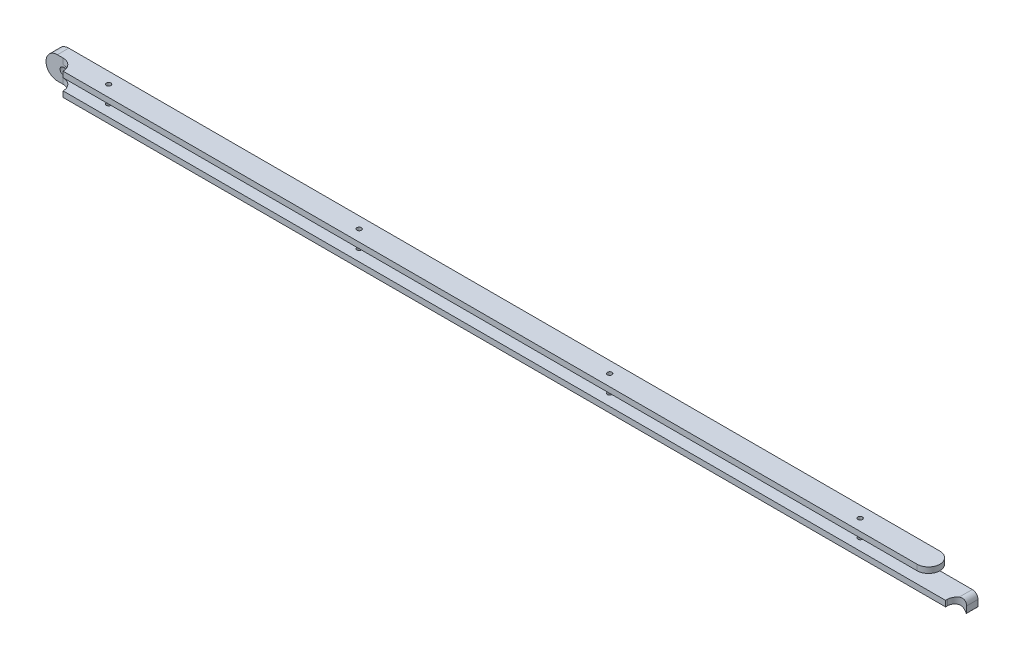
ISO-10303-21;
HEADER;
FILE_DESCRIPTION(('STEP AP214'),'2;1');
FILE_NAME('part.step','',(''),(''),'','','');
FILE_SCHEMA(('AUTOMOTIVE_DESIGN { 1 0 10303 214 1 1 1 1 }'));
ENDSEC;
DATA;
#1=APPLICATION_CONTEXT('core data for automotive mechanical design processes');
#2=APPLICATION_PROTOCOL_DEFINITION('international standard','automotive_design',2000,#1);
#3=PRODUCT_CONTEXT('',#1,'mechanical');
#4=PRODUCT('Part','Part','',(#3));
#5=PRODUCT_RELATED_PRODUCT_CATEGORY('part','',(#4));
#6=PRODUCT_DEFINITION_FORMATION('','',#4);
#7=PRODUCT_DEFINITION_CONTEXT('part definition',#1,'design');
#8=PRODUCT_DEFINITION('design','',#6,#7);
#9=PRODUCT_DEFINITION_SHAPE('','',#8);
#10=(LENGTH_UNIT() NAMED_UNIT(*) SI_UNIT(.MILLI.,.METRE.));
#11=(NAMED_UNIT(*) PLANE_ANGLE_UNIT() SI_UNIT($,.RADIAN.));
#12=(NAMED_UNIT(*) SI_UNIT($,.STERADIAN.) SOLID_ANGLE_UNIT());
#13=UNCERTAINTY_MEASURE_WITH_UNIT(LENGTH_MEASURE(1.E-05),#10,'distance_accuracy_value','');
#14=(GEOMETRIC_REPRESENTATION_CONTEXT(3) GLOBAL_UNCERTAINTY_ASSIGNED_CONTEXT((#13)) GLOBAL_UNIT_ASSIGNED_CONTEXT((#10,
#11,#12)) REPRESENTATION_CONTEXT('',''));
#15=CARTESIAN_POINT('',(0.,0.,0.));
#16=DIRECTION('',(0.,0.,1.));
#17=DIRECTION('',(1.,0.,0.));
#18=AXIS2_PLACEMENT_3D('',#15,#16,#17);
#19=CARTESIAN_POINT('',(187.499999999999,2.49999999999999,5.));
#20=DIRECTION('',(0.,-1.,0.));
#21=DIRECTION('',(0.,0.,-1.));
#22=AXIS2_PLACEMENT_3D('',#19,#20,#21);
#23=CYLINDRICAL_SURFACE('',#22,5.);
#24=DIRECTION('',(0.,-1.,0.));
#25=VECTOR('',#24,1.);
#26=CARTESIAN_POINT('',(187.499999999999,0.,10.));
#27=LINE('',#26,#25);
#28=CARTESIAN_POINT('',(187.499999999999,2.49999999999999,10.));
#29=VERTEX_POINT('',#28);
#30=CARTESIAN_POINT('',(187.499999999999,4.99999999999999,10.));
#31=VERTEX_POINT('',#30);
#32=EDGE_CURVE('E335',#29,#31,#27,.F.);
#33=ORIENTED_EDGE('',*,*,#32,.F.);
#34=CARTESIAN_POINT('',(187.499999999999,2.49999999999999,5.));
#35=DIRECTION('',(0.,1.,0.));
#36=DIRECTION('',(0.,0.,1.));
#37=AXIS2_PLACEMENT_3D('',#34,#35,#36);
#38=CIRCLE('',#37,5.);
#39=CARTESIAN_POINT('',(187.499999999999,2.49999999999999,0.));
#40=VERTEX_POINT('',#39);
#41=EDGE_CURVE('E46',#40,#29,#38,.F.);
#42=ORIENTED_EDGE('',*,*,#41,.F.);
#43=DIRECTION('',(0.,1.,0.));
#44=VECTOR('',#43,1.);
#45=CARTESIAN_POINT('',(187.499999999999,2.49999999999999,0.));
#46=LINE('',#45,#44);
#47=CARTESIAN_POINT('',(187.499999999999,4.99999999999999,0.));
#48=VERTEX_POINT('',#47);
#49=EDGE_CURVE('E359',#48,#40,#46,.F.);
#50=ORIENTED_EDGE('',*,*,#49,.F.);
#51=CARTESIAN_POINT('',(187.499999999999,4.99999999999999,5.));
#52=DIRECTION('',(0.,-1.,0.));
#53=DIRECTION('',(0.,0.,-1.));
#54=AXIS2_PLACEMENT_3D('',#51,#52,#53);
#55=CIRCLE('',#54,5.);
#56=EDGE_CURVE('E12',#31,#48,#55,.F.);
#57=ORIENTED_EDGE('',*,*,#56,.F.);
#58=EDGE_LOOP('',(#33,#42,#50,#57));
#59=FACE_BOUND('',#58,.T.);
#60=ADVANCED_FACE('F38',(#59),#23,.T.);
#61=CARTESIAN_POINT('',(-197.500000000001,2.49999999999999,5.));
#62=DIRECTION('',(0.,1.,0.));
#63=DIRECTION('',(0.,0.,1.));
#64=AXIS2_PLACEMENT_3D('',#61,#62,#63);
#65=PLANE('',#64);
#66=CARTESIAN_POINT('',(-172.500000000001,2.49999999999999,5.));
#67=DIRECTION('',(0.,1.,0.));
#68=DIRECTION('',(0.,0.,1.));
#69=AXIS2_PLACEMENT_3D('',#66,#67,#68);
#70=CIRCLE('',#69,0.999999999999998);
#71=CARTESIAN_POINT('',(-172.500000000001,2.49999999999999,6.));
#72=VERTEX_POINT('',#71);
#73=EDGE_CURVE('E191',#72,#72,#70,.T.);
#74=ORIENTED_EDGE('',*,*,#73,.T.);
#75=EDGE_LOOP('',(#74));
#76=FACE_BOUND('',#75,.T.);
#77=CARTESIAN_POINT('',(-62.5000000000008,2.49999999999999,5.));
#78=DIRECTION('',(0.,1.,0.));
#79=DIRECTION('',(0.,0.,1.));
#80=AXIS2_PLACEMENT_3D('',#77,#78,#79);
#81=CIRCLE('',#80,0.999999999999998);
#82=CARTESIAN_POINT('',(-62.5000000000008,2.49999999999999,6.));
#83=VERTEX_POINT('',#82);
#84=EDGE_CURVE('E356',#83,#83,#81,.T.);
#85=ORIENTED_EDGE('',*,*,#84,.T.);
#86=EDGE_LOOP('',(#85));
#87=FACE_BOUND('',#86,.T.);
#88=CARTESIAN_POINT('',(47.4999999999992,2.49999999999999,5.));
#89=DIRECTION('',(0.,1.,0.));
#90=DIRECTION('',(0.,0.,1.));
#91=AXIS2_PLACEMENT_3D('',#88,#89,#90);
#92=CIRCLE('',#91,0.999999999999998);
#93=CARTESIAN_POINT('',(47.4999999999992,2.49999999999999,6.));
#94=VERTEX_POINT('',#93);
#95=EDGE_CURVE('E351',#94,#94,#92,.T.);
#96=ORIENTED_EDGE('',*,*,#95,.T.);
#97=EDGE_LOOP('',(#96));
#98=FACE_BOUND('',#97,.T.);
#99=CARTESIAN_POINT('',(157.499999999999,2.49999999999999,5.));
#100=DIRECTION('',(0.,1.,0.));
#101=DIRECTION('',(0.,0.,1.));
#102=AXIS2_PLACEMENT_3D('',#99,#100,#101);
#103=CIRCLE('',#102,0.999999999999998);
#104=CARTESIAN_POINT('',(157.499999999999,2.49999999999999,6.));
#105=VERTEX_POINT('',#104);
#106=EDGE_CURVE('E346',#105,#105,#103,.T.);
#107=ORIENTED_EDGE('',*,*,#106,.T.);
#108=EDGE_LOOP('',(#107));
#109=FACE_BOUND('',#108,.T.);
#110=DIRECTION('',(1.,0.,0.));
#111=VECTOR('',#110,1.);
#112=CARTESIAN_POINT('',(-197.500000000001,2.49999999999999,0.));
#113=LINE('',#112,#111);
#114=CARTESIAN_POINT('',(-187.500000000001,2.49999999999999,0.));
#115=VERTEX_POINT('',#114);
#116=EDGE_CURVE('E252',#115,#40,#113,.T.);
#117=ORIENTED_EDGE('',*,*,#116,.T.);
#118=ORIENTED_EDGE('',*,*,#41,.T.);
#119=DIRECTION('',(1.,0.,0.));
#120=VECTOR('',#119,1.);
#121=CARTESIAN_POINT('',(-187.500000000001,2.49999999999999,10.));
#122=LINE('',#121,#120);
#123=CARTESIAN_POINT('',(-187.500000000001,2.49999999999999,10.));
#124=VERTEX_POINT('',#123);
#125=EDGE_CURVE('E199',#124,#29,#122,.T.);
#126=ORIENTED_EDGE('',*,*,#125,.F.);
#127=CARTESIAN_POINT('',(-192.500000000001,2.49999999999999,10.));
#128=DIRECTION('',(0.,1.,0.));
#129=DIRECTION('',(0.,0.,1.));
#130=AXIS2_PLACEMENT_3D('',#127,#128,#129);
#131=CIRCLE('',#130,5.);
#132=CARTESIAN_POINT('',(-192.500000000001,2.49999999999999,5.));
#133=VERTEX_POINT('',#132);
#134=EDGE_CURVE('E282',#133,#124,#131,.F.);
#135=ORIENTED_EDGE('',*,*,#134,.F.);
#136=DIRECTION('',(-1.,0.,0.));
#137=VECTOR('',#136,1.);
#138=CARTESIAN_POINT('',(0.,2.49999999999999,5.));
#139=LINE('',#138,#137);
#140=CARTESIAN_POINT('',(-187.500000000001,2.49999999999999,5.));
#141=VERTEX_POINT('',#140);
#142=EDGE_CURVE('E274',#141,#133,#139,.T.);
#143=ORIENTED_EDGE('',*,*,#142,.F.);
#144=DIRECTION('',(0.,0.,-1.));
#145=VECTOR('',#144,1.);
#146=CARTESIAN_POINT('',(-187.500000000001,2.49999999999999,5.));
#147=LINE('',#146,#145);
#148=EDGE_CURVE('E236',#141,#115,#147,.T.);
#149=ORIENTED_EDGE('',*,*,#148,.T.);
#150=EDGE_LOOP('',(#117,#118,#126,#135,#143,#149));
#151=FACE_BOUND('',#150,.T.);
#152=ADVANCED_FACE('F362',(#76,#87,#98,#109,#151),#65,.F.);
#153=CARTESIAN_POINT('',(-200.000000000001,4.99999999999999,5.));
#154=DIRECTION('',(0.,-1.,0.));
#155=DIRECTION('',(0.,0.,-1.));
#156=AXIS2_PLACEMENT_3D('',#153,#154,#155);
#157=PLANE('',#156);
#158=CARTESIAN_POINT('',(-172.500000000001,4.99999999999999,5.));
#159=DIRECTION('',(0.,1.,0.));
#160=DIRECTION('',(0.,0.,1.));
#161=AXIS2_PLACEMENT_3D('',#158,#159,#160);
#162=CIRCLE('',#161,0.999999999999998);
#163=CARTESIAN_POINT('',(-172.500000000001,4.99999999999999,6.));
#164=VERTEX_POINT('',#163);
#165=EDGE_CURVE('E341',#164,#164,#162,.T.);
#166=ORIENTED_EDGE('',*,*,#165,.F.);
#167=EDGE_LOOP('',(#166));
#168=FACE_BOUND('',#167,.T.);
#169=CARTESIAN_POINT('',(-62.5000000000008,4.99999999999999,5.));
#170=DIRECTION('',(0.,1.,0.));
#171=DIRECTION('',(0.,0.,1.));
#172=AXIS2_PLACEMENT_3D('',#169,#170,#171);
#173=CIRCLE('',#172,0.999999999999998);
#174=CARTESIAN_POINT('',(-62.5000000000008,4.99999999999999,6.));
#175=VERTEX_POINT('',#174);
#176=EDGE_CURVE('E672',#175,#175,#173,.T.);
#177=ORIENTED_EDGE('',*,*,#176,.F.);
#178=EDGE_LOOP('',(#177));
#179=FACE_BOUND('',#178,.T.);
#180=CARTESIAN_POINT('',(47.4999999999992,4.99999999999999,5.));
#181=DIRECTION('',(0.,1.,0.));
#182=DIRECTION('',(0.,0.,1.));
#183=AXIS2_PLACEMENT_3D('',#180,#181,#182);
#184=CIRCLE('',#183,0.999999999999998);
#185=CARTESIAN_POINT('',(47.4999999999992,4.99999999999999,6.));
#186=VERTEX_POINT('',#185);
#187=EDGE_CURVE('E669',#186,#186,#184,.T.);
#188=ORIENTED_EDGE('',*,*,#187,.F.);
#189=EDGE_LOOP('',(#188));
#190=FACE_BOUND('',#189,.T.);
#191=CARTESIAN_POINT('',(157.499999999999,4.99999999999999,5.));
#192=DIRECTION('',(0.,1.,0.));
#193=DIRECTION('',(0.,0.,1.));
#194=AXIS2_PLACEMENT_3D('',#191,#192,#193);
#195=CIRCLE('',#194,0.999999999999998);
#196=CARTESIAN_POINT('',(157.499999999999,4.99999999999999,6.));
#197=VERTEX_POINT('',#196);
#198=EDGE_CURVE('E666',#197,#197,#195,.T.);
#199=ORIENTED_EDGE('',*,*,#198,.F.);
#200=EDGE_LOOP('',(#199));
#201=FACE_BOUND('',#200,.T.);
#202=DIRECTION('',(-1.,0.,0.));
#203=VECTOR('',#202,1.);
#204=CARTESIAN_POINT('',(199.999999999999,4.99999999999999,10.));
#205=LINE('',#204,#203);
#206=CARTESIAN_POINT('',(-187.500000000001,4.99999999999999,10.));
#207=VERTEX_POINT('',#206);
#208=EDGE_CURVE('E209',#31,#207,#205,.T.);
#209=ORIENTED_EDGE('',*,*,#208,.F.);
#210=ORIENTED_EDGE('',*,*,#56,.T.);
#211=DIRECTION('',(-1.,0.,0.));
#212=VECTOR('',#211,1.);
#213=CARTESIAN_POINT('',(-200.000000000001,4.99999999999999,0.));
#214=LINE('',#213,#212);
#215=CARTESIAN_POINT('',(-195.000000000001,4.99999999999999,0.));
#216=VERTEX_POINT('',#215);
#217=EDGE_CURVE('E255',#48,#216,#214,.T.);
#218=ORIENTED_EDGE('',*,*,#217,.T.);
#219=DIRECTION('',(0.,0.,-1.));
#220=VECTOR('',#219,1.);
#221=CARTESIAN_POINT('',(-195.000000000001,4.99999999999999,5.));
#222=LINE('',#221,#220);
#223=CARTESIAN_POINT('',(-195.000000000001,4.99999999999999,5.));
#224=VERTEX_POINT('',#223);
#225=EDGE_CURVE('E266',#216,#224,#222,.F.);
#226=ORIENTED_EDGE('',*,*,#225,.T.);
#227=DIRECTION('',(-1.,0.,0.));
#228=VECTOR('',#227,1.);
#229=CARTESIAN_POINT('',(-200.000000000001,4.99999999999999,5.));
#230=LINE('',#229,#228);
#231=CARTESIAN_POINT('',(-192.500000000001,4.99999999999999,5.));
#232=VERTEX_POINT('',#231);
#233=EDGE_CURVE('E244',#232,#224,#230,.T.);
#234=ORIENTED_EDGE('',*,*,#233,.F.);
#235=CARTESIAN_POINT('',(-192.500000000001,4.99999999999999,10.));
#236=DIRECTION('',(0.,-1.,0.));
#237=DIRECTION('',(0.,0.,-1.));
#238=AXIS2_PLACEMENT_3D('',#235,#236,#237);
#239=CIRCLE('',#238,5.);
#240=EDGE_CURVE('E280',#207,#232,#239,.F.);
#241=ORIENTED_EDGE('',*,*,#240,.F.);
#242=EDGE_LOOP('',(#209,#210,#218,#226,#234,#241));
#243=FACE_BOUND('',#242,.T.);
#244=ADVANCED_FACE('F389',(#168,#179,#190,#201,#243),#157,.F.);
#245=CARTESIAN_POINT('',(0.,0.,0.));
#246=DIRECTION('',(0.,0.,1.));
#247=DIRECTION('',(1.,0.,0.));
#248=AXIS2_PLACEMENT_3D('',#245,#246,#247);
#249=PLANE('',#248);
#250=CARTESIAN_POINT('',(-192.311689795541,0.0941551022299583,0.));
#251=DIRECTION('',(0.,0.,-1.));
#252=DIRECTION('',(-1.,0.,0.));
#253=AXIS2_PLACEMENT_3D('',#250,#251,#252);
#254=CIRCLE('',#253,1.5);
#255=CARTESIAN_POINT('',(-193.811689795541,0.0941551022299583,0.));
#256=VERTEX_POINT('',#255);
#257=EDGE_CURVE('E226',#256,#256,#254,.T.);
#258=ORIENTED_EDGE('',*,*,#257,.F.);
#259=EDGE_LOOP('',(#258));
#260=FACE_BOUND('',#259,.T.);
#261=ORIENTED_EDGE('',*,*,#217,.F.);
#262=ORIENTED_EDGE('',*,*,#49,.T.);
#263=ORIENTED_EDGE('',*,*,#116,.F.);
#264=DIRECTION('',(0.,-1.,0.));
#265=VECTOR('',#264,1.);
#266=CARTESIAN_POINT('',(-187.500000000001,0.,0.));
#267=LINE('',#266,#265);
#268=CARTESIAN_POINT('',(-187.500000000001,-2.50000000000002,0.));
#269=VERTEX_POINT('',#268);
#270=EDGE_CURVE('E230',#115,#269,#267,.T.);
#271=ORIENTED_EDGE('',*,*,#270,.T.);
#272=DIRECTION('',(-1.,0.,0.));
#273=VECTOR('',#272,1.);
#274=CARTESIAN_POINT('',(-197.500000000001,-2.50000000000002,0.));
#275=LINE('',#274,#273);
#276=CARTESIAN_POINT('',(201.738979537004,-2.50000000000002,0.));
#277=VERTEX_POINT('',#276);
#278=EDGE_CURVE('E242',#277,#269,#275,.T.);
#279=ORIENTED_EDGE('',*,*,#278,.F.);
#280=CARTESIAN_POINT('',(201.738979537004,-5.00000000000002,0.));
#281=DIRECTION('',(0.,0.,-1.));
#282=DIRECTION('',(-1.,0.,0.));
#283=AXIS2_PLACEMENT_3D('',#280,#281,#282);
#284=CIRCLE('',#283,2.5);
#285=CARTESIAN_POINT('',(204.238979537004,-5.00000000000004,0.));
#286=VERTEX_POINT('',#285);
#287=EDGE_CURVE('E179',#286,#277,#284,.F.);
#288=ORIENTED_EDGE('',*,*,#287,.F.);
#289=DIRECTION('',(0.,1.,0.));
#290=VECTOR('',#289,1.);
#291=CARTESIAN_POINT('',(204.238979537004,0.,0.));
#292=LINE('',#291,#290);
#293=CARTESIAN_POINT('',(204.238979537004,-7.7599996640987,0.));
#294=VERTEX_POINT('',#293);
#295=EDGE_CURVE('E189',#294,#286,#292,.T.);
#296=ORIENTED_EDGE('',*,*,#295,.F.);
#297=CARTESIAN_POINT('',(204.113979537004,-7.7599996640987,0.));
#298=DIRECTION('',(0.,0.,-1.));
#299=DIRECTION('',(-1.,0.,0.));
#300=AXIS2_PLACEMENT_3D('',#297,#298,#299);
#301=CIRCLE('',#300,0.124999999999988);
#302=CARTESIAN_POINT('',(203.996457300071,-7.80258515254749,0.));
#303=VERTEX_POINT('',#302);
#304=EDGE_CURVE('E164',#294,#303,#301,.T.);
#305=ORIENTED_EDGE('',*,*,#304,.T.);
#306=CARTESIAN_POINT('',(199.999999999999,-9.25074586349727,0.));
#307=DIRECTION('',(0.,0.,-1.));
#308=DIRECTION('',(-1.,0.,0.));
#309=AXIS2_PLACEMENT_3D('',#306,#307,#308);
#310=CIRCLE('',#309,4.25074586349726);
#311=CARTESIAN_POINT('',(199.999999999999,-5.00000000000002,0.));
#312=VERTEX_POINT('',#311);
#313=EDGE_CURVE('E193',#312,#303,#310,.T.);
#314=ORIENTED_EDGE('',*,*,#313,.F.);
#315=DIRECTION('',(1.,0.,0.));
#316=VECTOR('',#315,1.);
#317=CARTESIAN_POINT('',(-200.000000000001,-5.00000000000002,0.));
#318=LINE('',#317,#316);
#319=CARTESIAN_POINT('',(-195.000000000001,-5.00000000000002,0.));
#320=VERTEX_POINT('',#319);
#321=EDGE_CURVE('E247',#320,#312,#318,.T.);
#322=ORIENTED_EDGE('',*,*,#321,.F.);
#323=CARTESIAN_POINT('',(-195.000000000001,0.,0.));
#324=DIRECTION('',(0.,0.,1.));
#325=DIRECTION('',(1.,0.,0.));
#326=AXIS2_PLACEMENT_3D('',#323,#324,#325);
#327=CIRCLE('',#326,5.);
#328=EDGE_CURVE('E271',#320,#216,#327,.F.);
#329=ORIENTED_EDGE('',*,*,#328,.T.);
#330=EDGE_LOOP('',(#261,#262,#263,#271,#279,#288,#296,#305,#314,#322,#329));
#331=FACE_BOUND('',#330,.T.);
#332=ADVANCED_FACE('F386',(#260,#331),#249,.F.);
#333=CARTESIAN_POINT('',(0.,0.,10.));
#334=DIRECTION('',(0.,0.,1.));
#335=DIRECTION('',(1.,0.,0.));
#336=AXIS2_PLACEMENT_3D('',#333,#334,#335);
#337=PLANE('',#336);
#338=ORIENTED_EDGE('',*,*,#125,.T.);
#339=ORIENTED_EDGE('',*,*,#32,.T.);
#340=ORIENTED_EDGE('',*,*,#208,.T.);
#341=DIRECTION('',(0.,1.,0.));
#342=VECTOR('',#341,1.);
#343=CARTESIAN_POINT('',(-187.500000000001,2.49999999999999,10.));
#344=LINE('',#343,#342);
#345=EDGE_CURVE('E211',#124,#207,#344,.T.);
#346=ORIENTED_EDGE('',*,*,#345,.F.);
#347=EDGE_LOOP('',(#338,#339,#340,#346));
#348=FACE_BOUND('',#347,.T.);
#349=ADVANCED_FACE('F366',(#348),#337,.T.);
#350=CARTESIAN_POINT('',(204.199999999999,0.,9.2));
#351=DIRECTION('',(0.,1.,0.));
#352=DIRECTION('',(0.,0.,1.));
#353=AXIS2_PLACEMENT_3D('',#350,#351,#352);
#354=CYLINDRICAL_SURFACE('',#353,4.2);
#355=CARTESIAN_POINT('',(204.199999999999,-4.56025202590845,5.));
#356=CARTESIAN_POINT('',(204.187804600789,-4.49196481343647,5.00001083744535));
#357=CARTESIAN_POINT('',(204.172754868996,-4.42419008745765,5.00005335432068));
#358=CARTESIAN_POINT('',(204.137078432987,-4.29012276381103,5.00043058945621));
#359=CARTESIAN_POINT('',(204.116451511297,-4.22383022404787,5.00076531911192));
#360=CARTESIAN_POINT('',(204.069729351325,-4.09312266042863,5.00195646927419));
#361=CARTESIAN_POINT('',(204.043628512036,-4.02870963722634,5.0028134258573));
#362=CARTESIAN_POINT('',(203.986178029292,-3.90230881771838,5.00534787190019));
#363=CARTESIAN_POINT('',(203.954828547608,-3.84032094673799,5.00702533607359));
#364=CARTESIAN_POINT('',(203.853132296124,-3.65850608631455,5.01379444432655));
#365=CARTESIAN_POINT('',(203.775155342878,-3.5428770101095,5.02062284722559));
#366=CARTESIAN_POINT('',(203.601580455367,-3.32670128543189,5.04193567246018));
#367=CARTESIAN_POINT('',(203.505997687653,-3.22614178945197,5.05641352507379));
#368=CARTESIAN_POINT('',(203.303950025444,-3.04587339623523,5.09545057690654));
#369=CARTESIAN_POINT('',(203.197914639677,-2.96561450055826,5.11968314015636));
#370=CARTESIAN_POINT('',(202.977089057138,-2.82416575109094,5.1803544200784));
#371=CARTESIAN_POINT('',(202.862306389895,-2.76295972259811,5.21678272848409));
#372=CARTESIAN_POINT('',(202.635203022091,-2.66304211219622,5.30060411169939));
#373=CARTESIAN_POINT('',(202.523074419053,-2.62330999307034,5.34731348658621));
#374=CARTESIAN_POINT('',(202.299384246619,-2.56084938538221,5.45260769974086));
#375=CARTESIAN_POINT('',(202.187824240284,-2.53815473244006,5.51121587693495));
#376=CARTESIAN_POINT('',(202.021457733276,-2.51533941143618,5.60857192436485));
#377=CARTESIAN_POINT('',(201.965021819095,-2.50961358464844,5.64341540541011));
#378=CARTESIAN_POINT('',(201.853660150564,-2.50200913348351,5.71587972218794));
#379=CARTESIAN_POINT('',(201.798734792702,-2.500131509847,5.75350127773535));
#380=CARTESIAN_POINT('',(201.690962055808,-2.49988226487252,5.83115404836204));
#381=CARTESIAN_POINT('',(201.638107131903,-2.5014964109182,5.87117483737245));
#382=CARTESIAN_POINT('',(201.534498381273,-2.50783637828312,5.9535421371921));
#383=CARTESIAN_POINT('',(201.483742965642,-2.51255979895699,5.99588683063193));
#384=CARTESIAN_POINT('',(201.434125233665,-2.51865684482455,6.0393138756026));
#385=B_SPLINE_CURVE_WITH_KNOTS('',3,(#355,#356,#357,#358,#359,#360,#361,#362,#363,#364,#365,
#366,#367,#368,#369,#370,#371,#372,#373,#374,#375,#376,#377,#378,#379,#380,#381,#382,#383,#384),
.UNSPECIFIED.,.F.,.F.,(4,2,2,2,2,2,2,2,2,2,2,2,2,2,4),(0.,0.208038043310331,0.416084199901774,
0.624344280687321,0.832597943722679,1.2492599613514,1.66556470954167,2.06895638881991,
2.47200467372262,2.85368487037161,3.23612107551123,3.43568316656409,3.63529714795821,
3.83409902698967,4.03274759247663),.UNSPECIFIED.);
#386=CARTESIAN_POINT('',(201.738979537004,-2.50000000000002,5.79656375398078));
#387=VERTEX_POINT('',#386);
#388=CARTESIAN_POINT('',(204.199999999999,-4.56025202590845,5.));
#389=VERTEX_POINT('',#388);
#390=EDGE_CURVE('E297',#387,#389,#385,.F.);
#391=ORIENTED_EDGE('',*,*,#390,.F.);
#392=CARTESIAN_POINT('',(204.199999999999,-2.50000000000002,9.2));
#393=DIRECTION('',(0.,-1.,0.));
#394=DIRECTION('',(1.,0.,0.));
#395=AXIS2_PLACEMENT_3D('',#392,#393,#394);
#396=CIRCLE('',#395,4.2);
#397=CARTESIAN_POINT('',(199.999999999999,-2.50000000000002,9.2));
#398=VERTEX_POINT('',#397);
#399=EDGE_CURVE('E336',#387,#398,#396,.F.);
#400=ORIENTED_EDGE('',*,*,#399,.T.);
#401=DIRECTION('',(0.,-1.,0.));
#402=VECTOR('',#401,1.);
#403=CARTESIAN_POINT('',(199.999999999999,0.,9.2));
#404=LINE('',#403,#402);
#405=CARTESIAN_POINT('',(199.999999999999,-5.00000000000002,9.2));
#406=VERTEX_POINT('',#405);
#407=EDGE_CURVE('E294',#406,#398,#404,.F.);
#408=ORIENTED_EDGE('',*,*,#407,.F.);
#409=CARTESIAN_POINT('',(203.996457300071,-7.8025851525475,5.00493499820252));
#410=CARTESIAN_POINT('',(203.959508884253,-7.70058280623714,5.0067453099316));
#411=CARTESIAN_POINT('',(203.918632285732,-7.60000293685804,5.00920081449357));
#412=CARTESIAN_POINT('',(203.829326180983,-7.40227442697984,5.01614445383127));
#413=CARTESIAN_POINT('',(203.780893285038,-7.3051273505205,5.0206335025739));
#414=CARTESIAN_POINT('',(203.676528893815,-7.11442654751201,5.03241813279791));
#415=CARTESIAN_POINT('',(203.620558056291,-7.02089523249275,5.03972884231316));
#416=CARTESIAN_POINT('',(203.501786143111,-6.83865997074523,5.05800666788615));
#417=CARTESIAN_POINT('',(203.438986040822,-6.7499553387726,5.06897326333388));
#418=CARTESIAN_POINT('',(203.306835828267,-6.57763562373711,5.09551249771345));
#419=CARTESIAN_POINT('',(203.237457309206,-6.49404544222408,5.11110579654904));
#420=CARTESIAN_POINT('',(203.093170493742,-6.33307290919273,5.14778256456306));
#421=CARTESIAN_POINT('',(203.018262853294,-6.25568982355181,5.16886538323161));
#422=CARTESIAN_POINT('',(202.864132018409,-6.1079853305902,5.2172925605384));
#423=CARTESIAN_POINT('',(202.784923462039,-6.03764203446419,5.24461658467739));
#424=CARTESIAN_POINT('',(202.623151658287,-5.90427005062843,5.30628247832193));
#425=CARTESIAN_POINT('',(202.540588885846,-5.84124033219158,5.34062335703051));
#426=CARTESIAN_POINT('',(202.381355248289,-5.72844645373988,5.41325329668081));
#427=CARTESIAN_POINT('',(202.304863280641,-5.67799179783718,5.4508643281638));
#428=CARTESIAN_POINT('',(202.151342648656,-5.5835005989259,5.53249975445992));
#429=CARTESIAN_POINT('',(202.0743140251,-5.53946357370883,5.57652366692391));
#430=CARTESIAN_POINT('',(201.92080356399,-5.45773624540006,5.6710633872094));
#431=CARTESIAN_POINT('',(201.844322076643,-5.42004971011267,5.72158301788428));
#432=CARTESIAN_POINT('',(201.69305616386,-5.35083293551133,5.82897104653955));
#433=CARTESIAN_POINT('',(201.618271709356,-5.31930259067762,5.88583933567492));
#434=CARTESIAN_POINT('',(201.4768158224,-5.26411942812512,6.0012540614143));
#435=CARTESIAN_POINT('',(201.409951941642,-5.2400581110707,6.05937044506805));
#436=CARTESIAN_POINT('',(201.279259677469,-5.1964784111223,6.18052435460614));
#437=CARTESIAN_POINT('',(201.21543226278,-5.17696147039339,6.24356343426359));
#438=CARTESIAN_POINT('',(201.029505100269,-5.12454564034053,6.43951410154693));
#439=CARTESIAN_POINT('',(200.912852136182,-5.0977416935635,6.5793468201262));
#440=CARTESIAN_POINT('',(200.689003003539,-5.05452748296392,6.88653943971975));
#441=CARTESIAN_POINT('',(200.583444178731,-5.03918958930083,7.05522765144601));
#442=CARTESIAN_POINT('',(200.397041768414,-5.01753991935913,7.40639562671392));
#443=CARTESIAN_POINT('',(200.316209901701,-5.01123241763983,7.58888187859445));
#444=CARTESIAN_POINT('',(200.210681616989,-5.00505673807253,7.88167666939876));
#445=CARTESIAN_POINT('',(200.176874769855,-5.00358012369789,7.98877198535147));
#446=CARTESIAN_POINT('',(200.117931951032,-5.00153292862819,8.20536267286855));
#447=CARTESIAN_POINT('',(200.092796656375,-5.00096241866461,8.31485823112212));
#448=CARTESIAN_POINT('',(200.051372017409,-5.00026007866006,8.53554533166774));
#449=CARTESIAN_POINT('',(200.0350858121,-5.00012840420034,8.64673746141668));
#450=CARTESIAN_POINT('',(200.011473523204,-4.99999909022755,8.87006999932316));
#451=CARTESIAN_POINT('',(200.004147495357,-5.00000145154828,8.9822104133754));
#452=CARTESIAN_POINT('',(199.998367558536,-4.99999890165392,9.2121777076191));
#453=CARTESIAN_POINT('',(200.000362115298,-4.99999363143426,9.3300160914179));
#454=CARTESIAN_POINT('',(200.014243094255,-5.00001891386636,9.56511440523739));
#455=CARTESIAN_POINT('',(200.026130101329,-5.00004946863628,9.68237430064329));
#456=CARTESIAN_POINT('',(200.059730047659,-5.0003841094806,9.91557333324442));
#457=CARTESIAN_POINT('',(200.08145077687,-5.00068841259858,10.0315113484996));
#458=CARTESIAN_POINT('',(200.134550788859,-5.00205605773175,10.2611506997448));
#459=CARTESIAN_POINT('',(200.165930234006,-5.00311941250753,10.3748519980999));
#460=CARTESIAN_POINT('',(200.202053851639,-5.00480490334763,10.4870223754138));
#461=B_SPLINE_CURVE_WITH_KNOTS('',3,(#409,#410,#411,#412,#413,#414,#415,#416,#417,#418,#419,
#420,#421,#422,#423,#424,#425,#426,#427,#428,#429,#430,#431,#432,#433,#434,#435,#436,#437,#438,
#439,#440,#441,#442,#443,#444,#445,#446,#447,#448,#449,#450,#451,#452,#453,#454,#455,#456,#457,
#458,#459,#460),.UNSPECIFIED.,.F.,.F.,(4,2,2,2,2,2,2,2,2,2,2,2,2,2,2,2,2,2,2,2,2,2,2,2,2,4),(0.,
0.325445611891434,0.651037639131569,0.978400101016581,1.30571596532491,1.63451599194728,
1.96327707337802,2.29098192122684,2.61864052828941,2.9153902449512,3.21211765289795,
3.50902049677627,3.80591825116429,4.08100903881601,4.35618700834317,4.90611280879823,
5.50260742938219,6.09938430898598,6.43601589926034,6.77267376606791,7.1094509761926,
7.4462302813284,7.7993762515581,8.15254310260623,8.5059902118575,8.85944326313241),.UNSPECIFIED.);
#462=CARTESIAN_POINT('',(203.996457300071,-7.80258515254751,5.00493499820252));
#463=VERTEX_POINT('',#462);
#464=EDGE_CURVE('E328',#406,#463,#461,.F.);
#465=ORIENTED_EDGE('',*,*,#464,.T.);
#466=CARTESIAN_POINT('',(204.199999999999,-7.85069409582434,5.));
#467=CARTESIAN_POINT('',(204.194903380064,-7.85553630432866,4.99999966383895));
#468=CARTESIAN_POINT('',(204.189391920949,-7.85993857551015,5.00000924043573));
#469=CARTESIAN_POINT('',(204.177714785506,-7.86775749551297,5.00005516252043));
#470=CARTESIAN_POINT('',(204.171549572326,-7.87117483580515,5.00009148916446));
#471=CARTESIAN_POINT('',(204.158729727055,-7.87692660020943,5.00019785962558));
#472=CARTESIAN_POINT('',(204.152074866696,-7.87926051548515,5.00026791925414));
#473=CARTESIAN_POINT('',(204.138470002124,-7.88277810353593,5.00044523159231));
#474=CARTESIAN_POINT('',(204.131520064719,-7.88396203524044,5.00055247592204));
#475=CARTESIAN_POINT('',(204.117521034263,-7.88514680345868,5.00080409729742));
#476=CARTESIAN_POINT('',(204.110471945963,-7.88514769645053,5.00094847257011));
#477=CARTESIAN_POINT('',(204.096472778767,-7.88396686035858,5.00127029303848));
#478=CARTESIAN_POINT('',(204.089522721878,-7.88278487246755,5.00144774546433));
#479=CARTESIAN_POINT('',(204.075917143506,-7.87927095442922,5.0018278013167));
#480=CARTESIAN_POINT('',(204.06926175215,-7.87693852165061,5.00203041570754));
#481=CARTESIAN_POINT('',(204.056438575484,-7.87119048193246,5.00244936874127));
#482=CARTESIAN_POINT('',(204.050270688956,-7.86777510058093,5.00266570451837));
#483=CARTESIAN_POINT('',(204.038591731603,-7.85995511364837,5.00309857048755));
#484=CARTESIAN_POINT('',(204.033081097235,-7.85554985626455,5.00331510071366));
#485=CARTESIAN_POINT('',(204.02287607075,-7.84587533651206,5.00373342020282));
#486=CARTESIAN_POINT('',(204.018181852049,-7.84060589104084,5.00393520632877));
#487=CARTESIAN_POINT('',(204.009748136118,-7.82935464857154,5.00430908308941));
#488=CARTESIAN_POINT('',(204.006008195456,-7.82337318433411,5.00448118750439));
#489=CARTESIAN_POINT('',(203.999578031763,-7.81086413070219,5.00478357770873));
#490=CARTESIAN_POINT('',(203.996888585102,-7.8043361417077,5.00491383255649));
#491=CARTESIAN_POINT('',(203.994776178631,-7.79762358405079,5.00501690311595));
#492=B_SPLINE_CURVE_WITH_KNOTS('',3,(#466,#467,#468,#469,#470,#471,#472,#473,#474,#475,#476,
#477,#478,#479,#480,#481,#482,#483,#484,#485,#486,#487,#488,#489,#490,#491),.UNSPECIFIED.,.F.,
.F.,(4,2,2,2,2,2,2,2,2,2,2,2,4),(0.,0.0210623638286904,0.0421099046017932,0.063167320489673,
0.084219994005732,0.10527166246969,0.126327937919234,0.147393421050756,0.168454518930686,
0.189529525744722,0.210609003674272,0.231678668543729,0.252763875666101),.UNSPECIFIED.);
#493=CARTESIAN_POINT('',(204.199999999999,-7.85069409582434,5.));
#494=VERTEX_POINT('',#493);
#495=EDGE_CURVE('E304',#494,#463,#492,.T.);
#496=ORIENTED_EDGE('',*,*,#495,.F.);
#497=DIRECTION('',(0.,-1.,0.));
#498=VECTOR('',#497,1.);
#499=CARTESIAN_POINT('',(204.199999999999,0.,5.));
#500=LINE('',#499,#498);
#501=EDGE_CURVE('E184',#389,#494,#500,.T.);
#502=ORIENTED_EDGE('',*,*,#501,.F.);
#503=EDGE_LOOP('',(#391,#400,#408,#465,#496,#502));
#504=FACE_BOUND('',#503,.T.);
#505=ADVANCED_FACE('F311',(#504),#354,.F.);
#506=CARTESIAN_POINT('',(199.999999999999,-2.50000000000002,5.));
#507=DIRECTION('',(-1.,0.,0.));
#508=DIRECTION('',(0.,0.,1.));
#509=AXIS2_PLACEMENT_3D('',#506,#507,#508);
#510=PLANE('',#509);
#511=DIRECTION('',(0.,0.,-1.));
#512=VECTOR('',#511,1.);
#513=CARTESIAN_POINT('',(199.999999999999,-5.00000000000002,5.));
#514=LINE('',#513,#512);
#515=CARTESIAN_POINT('',(199.999999999999,-5.00000000000002,10.));
#516=VERTEX_POINT('',#515);
#517=EDGE_CURVE('E250',#516,#406,#514,.T.);
#518=ORIENTED_EDGE('',*,*,#517,.T.);
#519=ORIENTED_EDGE('',*,*,#407,.T.);
#520=DIRECTION('',(0.,0.,-1.));
#521=VECTOR('',#520,1.);
#522=CARTESIAN_POINT('',(199.999999999999,-2.50000000000002,5.));
#523=LINE('',#522,#521);
#524=CARTESIAN_POINT('',(199.999999999999,-2.50000000000002,10.));
#525=VERTEX_POINT('',#524);
#526=EDGE_CURVE('E260',#525,#398,#523,.T.);
#527=ORIENTED_EDGE('',*,*,#526,.F.);
#528=DIRECTION('',(0.,1.,0.));
#529=VECTOR('',#528,1.);
#530=CARTESIAN_POINT('',(199.999999999999,-5.00000000000002,10.));
#531=LINE('',#530,#529);
#532=EDGE_CURVE('E220',#516,#525,#531,.T.);
#533=ORIENTED_EDGE('',*,*,#532,.F.);
#534=EDGE_LOOP('',(#518,#519,#527,#533));
#535=FACE_BOUND('',#534,.T.);
#536=ADVANCED_FACE('F407',(#535),#510,.F.);
#537=CARTESIAN_POINT('',(-192.500000000001,-5.00000000000002,10.));
#538=DIRECTION('',(0.,1.,0.));
#539=DIRECTION('',(0.,0.,1.));
#540=AXIS2_PLACEMENT_3D('',#537,#538,#539);
#541=CYLINDRICAL_SURFACE('',#540,5.);
#542=DIRECTION('',(0.,1.,0.));
#543=VECTOR('',#542,1.);
#544=CARTESIAN_POINT('',(-187.500000000001,-5.00000000000002,10.));
#545=LINE('',#544,#543);
#546=CARTESIAN_POINT('',(-187.500000000001,-5.00000000000002,10.));
#547=VERTEX_POINT('',#546);
#548=CARTESIAN_POINT('',(-187.500000000001,-2.50000000000002,10.));
#549=VERTEX_POINT('',#548);
#550=EDGE_CURVE('E214',#547,#549,#545,.T.);
#551=ORIENTED_EDGE('',*,*,#550,.T.);
#552=CARTESIAN_POINT('',(-192.500000000001,-2.50000000000002,10.));
#553=DIRECTION('',(0.,-1.,0.));
#554=DIRECTION('',(1.,0.,0.));
#555=AXIS2_PLACEMENT_3D('',#552,#553,#554);
#556=CIRCLE('',#555,5.);
#557=CARTESIAN_POINT('',(-192.500000000001,-2.50000000000002,5.));
#558=VERTEX_POINT('',#557);
#559=EDGE_CURVE('E289',#549,#558,#556,.F.);
#560=ORIENTED_EDGE('',*,*,#559,.T.);
#561=DIRECTION('',(0.,-1.,0.));
#562=VECTOR('',#561,1.);
#563=CARTESIAN_POINT('',(-192.500000000001,-5.00000000000002,5.));
#564=LINE('',#563,#562);
#565=CARTESIAN_POINT('',(-192.500000000001,-5.00000000000002,5.));
#566=VERTEX_POINT('',#565);
#567=EDGE_CURVE('E286',#566,#558,#564,.F.);
#568=ORIENTED_EDGE('',*,*,#567,.F.);
#569=CARTESIAN_POINT('',(-192.500000000001,-5.00000000000002,10.));
#570=DIRECTION('',(0.,1.,0.));
#571=DIRECTION('',(0.,0.,1.));
#572=AXIS2_PLACEMENT_3D('',#569,#570,#571);
#573=CIRCLE('',#572,5.);
#574=EDGE_CURVE('E291',#566,#547,#573,.F.);
#575=ORIENTED_EDGE('',*,*,#574,.T.);
#576=EDGE_LOOP('',(#551,#560,#568,#575));
#577=FACE_BOUND('',#576,.T.);
#578=ADVANCED_FACE('F401',(#577),#541,.F.);
#579=CARTESIAN_POINT('',(-192.500000000001,2.5000000000001,10.));
#580=DIRECTION('',(0.,1.,0.));
#581=DIRECTION('',(-1.,0.,0.));
#582=AXIS2_PLACEMENT_3D('',#579,#580,#581);
#583=CYLINDRICAL_SURFACE('',#582,5.);
#584=ORIENTED_EDGE('',*,*,#345,.T.);
#585=ORIENTED_EDGE('',*,*,#240,.T.);
#586=DIRECTION('',(0.,-1.,0.));
#587=VECTOR('',#586,1.);
#588=CARTESIAN_POINT('',(-192.500000000001,2.5000000000001,5.));
#589=LINE('',#588,#587);
#590=EDGE_CURVE('E277',#133,#232,#589,.F.);
#591=ORIENTED_EDGE('',*,*,#590,.F.);
#592=ORIENTED_EDGE('',*,*,#134,.T.);
#593=EDGE_LOOP('',(#584,#585,#591,#592));
#594=FACE_BOUND('',#593,.T.);
#595=ADVANCED_FACE('F369',(#594),#583,.F.);
#596=CARTESIAN_POINT('',(0.,0.,5.));
#597=DIRECTION('',(0.,0.,1.));
#598=DIRECTION('',(1.,0.,0.));
#599=AXIS2_PLACEMENT_3D('',#596,#597,#598);
#600=PLANE('',#599);
#601=DIRECTION('',(1.,0.,0.));
#602=VECTOR('',#601,1.);
#603=CARTESIAN_POINT('',(-200.000000000001,-5.00000000000002,5.));
#604=LINE('',#603,#602);
#605=CARTESIAN_POINT('',(-195.000000000001,-5.00000000000002,5.));
#606=VERTEX_POINT('',#605);
#607=EDGE_CURVE('E246',#606,#566,#604,.T.);
#608=ORIENTED_EDGE('',*,*,#607,.T.);
#609=ORIENTED_EDGE('',*,*,#567,.T.);
#610=DIRECTION('',(1.,0.,0.));
#611=VECTOR('',#610,1.);
#612=CARTESIAN_POINT('',(0.,-2.50000000000002,5.));
#613=LINE('',#612,#611);
#614=CARTESIAN_POINT('',(-187.500000000001,-2.50000000000002,5.));
#615=VERTEX_POINT('',#614);
#616=EDGE_CURVE('E284',#558,#615,#613,.T.);
#617=ORIENTED_EDGE('',*,*,#616,.T.);
#618=DIRECTION('',(0.,-1.,0.));
#619=VECTOR('',#618,1.);
#620=CARTESIAN_POINT('',(-187.500000000001,0.,5.));
#621=LINE('',#620,#619);
#622=EDGE_CURVE('E233',#141,#615,#621,.T.);
#623=ORIENTED_EDGE('',*,*,#622,.F.);
#624=ORIENTED_EDGE('',*,*,#142,.T.);
#625=ORIENTED_EDGE('',*,*,#590,.T.);
#626=ORIENTED_EDGE('',*,*,#233,.T.);
#627=CARTESIAN_POINT('',(-195.000000000001,0.,5.));
#628=DIRECTION('',(0.,0.,1.));
#629=DIRECTION('',(1.,0.,0.));
#630=AXIS2_PLACEMENT_3D('',#627,#628,#629);
#631=CIRCLE('',#630,5.);
#632=EDGE_CURVE('E269',#224,#606,#631,.T.);
#633=ORIENTED_EDGE('',*,*,#632,.T.);
#634=EDGE_LOOP('',(#608,#609,#617,#623,#624,#625,#626,#633));
#635=FACE_BOUND('',#634,.T.);
#636=CARTESIAN_POINT('',(-192.311689795541,0.0941551022299583,5.));
#637=DIRECTION('',(0.,0.,-1.));
#638=DIRECTION('',(-1.,0.,0.));
#639=AXIS2_PLACEMENT_3D('',#636,#637,#638);
#640=CIRCLE('',#639,1.5);
#641=CARTESIAN_POINT('',(-193.811689795541,0.0941551022299583,5.));
#642=VERTEX_POINT('',#641);
#643=EDGE_CURVE('E227',#642,#642,#640,.T.);
#644=ORIENTED_EDGE('',*,*,#643,.T.);
#645=EDGE_LOOP('',(#644));
#646=FACE_BOUND('',#645,.T.);
#647=ADVANCED_FACE('F377',(#635,#646),#600,.T.);
#648=CARTESIAN_POINT('',(-195.000000000001,0.,5.));
#649=DIRECTION('',(0.,0.,-1.));
#650=DIRECTION('',(-1.,0.,0.));
#651=AXIS2_PLACEMENT_3D('',#648,#649,#650);
#652=CYLINDRICAL_SURFACE('',#651,5.);
#653=DIRECTION('',(0.,0.,-1.));
#654=VECTOR('',#653,1.);
#655=CARTESIAN_POINT('',(-195.000000000001,-5.00000000000002,5.));
#656=LINE('',#655,#654);
#657=EDGE_CURVE('E263',#606,#320,#656,.T.);
#658=ORIENTED_EDGE('',*,*,#657,.F.);
#659=ORIENTED_EDGE('',*,*,#632,.F.);
#660=ORIENTED_EDGE('',*,*,#225,.F.);
#661=ORIENTED_EDGE('',*,*,#328,.F.);
#662=EDGE_LOOP('',(#658,#659,#660,#661));
#663=FACE_BOUND('',#662,.T.);
#664=ADVANCED_FACE('F394',(#663),#652,.T.);
#665=CARTESIAN_POINT('',(-197.500000000001,-2.50000000000002,5.));
#666=DIRECTION('',(0.,-1.,0.));
#667=DIRECTION('',(1.,0.,0.));
#668=AXIS2_PLACEMENT_3D('',#665,#666,#667);
#669=PLANE('',#668);
#670=CARTESIAN_POINT('',(-172.500000000001,-2.50000000000002,5.));
#671=DIRECTION('',(0.,-1.,0.));
#672=DIRECTION('',(1.,0.,0.));
#673=AXIS2_PLACEMENT_3D('',#670,#671,#672);
#674=CIRCLE('',#673,0.999999999999998);
#675=CARTESIAN_POINT('',(-171.500000000001,-2.50000000000002,5.));
#676=VERTEX_POINT('',#675);
#677=EDGE_CURVE('E355',#676,#676,#674,.T.);
#678=ORIENTED_EDGE('',*,*,#677,.T.);
#679=EDGE_LOOP('',(#678));
#680=FACE_BOUND('',#679,.T.);
#681=CARTESIAN_POINT('',(-62.5000000000008,-2.50000000000002,5.));
#682=DIRECTION('',(0.,-1.,0.));
#683=DIRECTION('',(1.,0.,0.));
#684=AXIS2_PLACEMENT_3D('',#681,#682,#683);
#685=CIRCLE('',#684,0.999999999999998);
#686=CARTESIAN_POINT('',(-61.5000000000008,-2.50000000000002,5.));
#687=VERTEX_POINT('',#686);
#688=EDGE_CURVE('E350',#687,#687,#685,.T.);
#689=ORIENTED_EDGE('',*,*,#688,.T.);
#690=EDGE_LOOP('',(#689));
#691=FACE_BOUND('',#690,.T.);
#692=CARTESIAN_POINT('',(47.4999999999992,-2.50000000000002,5.));
#693=DIRECTION('',(0.,-1.,0.));
#694=DIRECTION('',(1.,0.,0.));
#695=AXIS2_PLACEMENT_3D('',#692,#693,#694);
#696=CIRCLE('',#695,0.999999999999998);
#697=CARTESIAN_POINT('',(48.4999999999992,-2.50000000000002,5.));
#698=VERTEX_POINT('',#697);
#699=EDGE_CURVE('E345',#698,#698,#696,.T.);
#700=ORIENTED_EDGE('',*,*,#699,.T.);
#701=EDGE_LOOP('',(#700));
#702=FACE_BOUND('',#701,.T.);
#703=CARTESIAN_POINT('',(157.499999999999,-2.50000000000002,5.));
#704=DIRECTION('',(0.,-1.,0.));
#705=DIRECTION('',(1.,0.,0.));
#706=AXIS2_PLACEMENT_3D('',#703,#704,#705);
#707=CIRCLE('',#706,0.999999999999998);
#708=CARTESIAN_POINT('',(158.499999999999,-2.50000000000002,5.));
#709=VERTEX_POINT('',#708);
#710=EDGE_CURVE('E340',#709,#709,#707,.T.);
#711=ORIENTED_EDGE('',*,*,#710,.T.);
#712=EDGE_LOOP('',(#711));
#713=FACE_BOUND('',#712,.T.);
#714=ORIENTED_EDGE('',*,*,#278,.T.);
#715=DIRECTION('',(0.,0.,-1.));
#716=VECTOR('',#715,1.);
#717=CARTESIAN_POINT('',(-187.500000000001,-2.50000000000002,5.));
#718=LINE('',#717,#716);
#719=EDGE_CURVE('E239',#615,#269,#718,.T.);
#720=ORIENTED_EDGE('',*,*,#719,.F.);
#721=ORIENTED_EDGE('',*,*,#616,.F.);
#722=ORIENTED_EDGE('',*,*,#559,.F.);
#723=DIRECTION('',(-1.,0.,0.));
#724=VECTOR('',#723,1.);
#725=CARTESIAN_POINT('',(199.999999999999,-2.50000000000002,10.));
#726=LINE('',#725,#724);
#727=EDGE_CURVE('E217',#525,#549,#726,.T.);
#728=ORIENTED_EDGE('',*,*,#727,.F.);
#729=ORIENTED_EDGE('',*,*,#526,.T.);
#730=ORIENTED_EDGE('',*,*,#399,.F.);
#731=DIRECTION('',(0.,0.,-1.));
#732=VECTOR('',#731,1.);
#733=CARTESIAN_POINT('',(201.738979537004,-2.50000000000002,5.));
#734=LINE('',#733,#732);
#735=EDGE_CURVE('E200',#387,#277,#734,.T.);
#736=ORIENTED_EDGE('',*,*,#735,.T.);
#737=EDGE_LOOP('',(#714,#720,#721,#722,#728,#729,#730,#736));
#738=FACE_BOUND('',#737,.T.);
#739=ADVANCED_FACE('F383',(#680,#691,#702,#713,#738),#669,.F.);
#740=CARTESIAN_POINT('',(-200.000000000001,-5.00000000000002,5.));
#741=DIRECTION('',(0.,1.,0.));
#742=DIRECTION('',(0.,0.,1.));
#743=AXIS2_PLACEMENT_3D('',#740,#741,#742);
#744=PLANE('',#743);
#745=CARTESIAN_POINT('',(-172.500000000001,-5.00000000000002,5.));
#746=DIRECTION('',(0.,1.,0.));
#747=DIRECTION('',(0.,0.,1.));
#748=AXIS2_PLACEMENT_3D('',#745,#746,#747);
#749=CIRCLE('',#748,0.999999999999998);
#750=CARTESIAN_POINT('',(-172.500000000001,-5.00000000000002,6.));
#751=VERTEX_POINT('',#750);
#752=EDGE_CURVE('E352',#751,#751,#749,.T.);
#753=ORIENTED_EDGE('',*,*,#752,.T.);
#754=EDGE_LOOP('',(#753));
#755=FACE_BOUND('',#754,.T.);
#756=CARTESIAN_POINT('',(-62.5000000000008,-5.00000000000002,5.));
#757=DIRECTION('',(0.,1.,0.));
#758=DIRECTION('',(0.,0.,1.));
#759=AXIS2_PLACEMENT_3D('',#756,#757,#758);
#760=CIRCLE('',#759,0.999999999999998);
#761=CARTESIAN_POINT('',(-62.5000000000008,-5.00000000000002,6.));
#762=VERTEX_POINT('',#761);
#763=EDGE_CURVE('E347',#762,#762,#760,.T.);
#764=ORIENTED_EDGE('',*,*,#763,.T.);
#765=EDGE_LOOP('',(#764));
#766=FACE_BOUND('',#765,.T.);
#767=CARTESIAN_POINT('',(47.4999999999992,-5.00000000000002,5.));
#768=DIRECTION('',(0.,1.,0.));
#769=DIRECTION('',(0.,0.,1.));
#770=AXIS2_PLACEMENT_3D('',#767,#768,#769);
#771=CIRCLE('',#770,0.999999999999998);
#772=CARTESIAN_POINT('',(47.4999999999992,-5.00000000000002,6.));
#773=VERTEX_POINT('',#772);
#774=EDGE_CURVE('E342',#773,#773,#771,.T.);
#775=ORIENTED_EDGE('',*,*,#774,.T.);
#776=EDGE_LOOP('',(#775));
#777=FACE_BOUND('',#776,.T.);
#778=CARTESIAN_POINT('',(157.499999999999,-5.00000000000002,5.));
#779=DIRECTION('',(0.,1.,0.));
#780=DIRECTION('',(0.,0.,1.));
#781=AXIS2_PLACEMENT_3D('',#778,#779,#780);
#782=CIRCLE('',#781,0.999999999999998);
#783=CARTESIAN_POINT('',(157.499999999999,-5.00000000000002,6.));
#784=VERTEX_POINT('',#783);
#785=EDGE_CURVE('E337',#784,#784,#782,.T.);
#786=ORIENTED_EDGE('',*,*,#785,.T.);
#787=EDGE_LOOP('',(#786));
#788=FACE_BOUND('',#787,.T.);
#789=ORIENTED_EDGE('',*,*,#607,.F.);
#790=ORIENTED_EDGE('',*,*,#657,.T.);
#791=ORIENTED_EDGE('',*,*,#321,.T.);
#792=DIRECTION('',(0.,0.,-1.));
#793=VECTOR('',#792,1.);
#794=CARTESIAN_POINT('',(199.999999999999,-5.00000000000002,5.));
#795=LINE('',#794,#793);
#796=EDGE_CURVE('E203',#406,#312,#795,.T.);
#797=ORIENTED_EDGE('',*,*,#796,.F.);
#798=ORIENTED_EDGE('',*,*,#517,.F.);
#799=DIRECTION('',(1.,0.,0.));
#800=VECTOR('',#799,1.);
#801=CARTESIAN_POINT('',(-187.500000000001,-5.00000000000002,10.));
#802=LINE('',#801,#800);
#803=EDGE_CURVE('E223',#547,#516,#802,.T.);
#804=ORIENTED_EDGE('',*,*,#803,.F.);
#805=ORIENTED_EDGE('',*,*,#574,.F.);
#806=EDGE_LOOP('',(#789,#790,#791,#797,#798,#804,#805));
#807=FACE_BOUND('',#806,.T.);
#808=ADVANCED_FACE('F397',(#755,#766,#777,#788,#807),#744,.F.);
#809=CARTESIAN_POINT('',(-187.500000000001,0.,5.));
#810=DIRECTION('',(1.,0.,0.));
#811=DIRECTION('',(0.,0.,-1.));
#812=AXIS2_PLACEMENT_3D('',#809,#810,#811);
#813=PLANE('',#812);
#814=ORIENTED_EDGE('',*,*,#270,.F.);
#815=ORIENTED_EDGE('',*,*,#148,.F.);
#816=ORIENTED_EDGE('',*,*,#622,.T.);
#817=ORIENTED_EDGE('',*,*,#719,.T.);
#818=EDGE_LOOP('',(#814,#815,#816,#817));
#819=FACE_BOUND('',#818,.T.);
#820=ADVANCED_FACE('F376',(#819),#813,.T.);
#821=CARTESIAN_POINT('',(-192.311689795541,0.0941551022299583,5.));
#822=DIRECTION('',(0.,0.,-1.));
#823=DIRECTION('',(-1.,0.,0.));
#824=AXIS2_PLACEMENT_3D('',#821,#822,#823);
#825=CYLINDRICAL_SURFACE('',#824,1.5);
#826=ORIENTED_EDGE('',*,*,#643,.F.);
#827=EDGE_LOOP('',(#826));
#828=FACE_BOUND('',#827,.T.);
#829=ORIENTED_EDGE('',*,*,#257,.T.);
#830=EDGE_LOOP('',(#829));
#831=FACE_BOUND('',#830,.T.);
#832=ADVANCED_FACE('F497',(#828,#831),#825,.F.);
#833=CARTESIAN_POINT('',(0.,0.,10.));
#834=DIRECTION('',(0.,0.,1.));
#835=DIRECTION('',(1.,0.,0.));
#836=AXIS2_PLACEMENT_3D('',#833,#834,#835);
#837=PLANE('',#836);
#838=ORIENTED_EDGE('',*,*,#550,.F.);
#839=ORIENTED_EDGE('',*,*,#803,.T.);
#840=ORIENTED_EDGE('',*,*,#532,.T.);
#841=ORIENTED_EDGE('',*,*,#727,.T.);
#842=EDGE_LOOP('',(#838,#839,#840,#841));
#843=FACE_BOUND('',#842,.T.);
#844=ADVANCED_FACE('F404',(#843),#837,.T.);
#845=CARTESIAN_POINT('',(204.238979537004,0.,5.));
#846=DIRECTION('',(-1.,0.,0.));
#847=DIRECTION('',(0.,0.,1.));
#848=AXIS2_PLACEMENT_3D('',#845,#846,#847);
#849=PLANE('',#848);
#850=ORIENTED_EDGE('',*,*,#295,.T.);
#851=DIRECTION('',(0.,0.,-1.));
#852=VECTOR('',#851,1.);
#853=CARTESIAN_POINT('',(204.238979537004,-5.00000000000004,5.));
#854=LINE('',#853,#852);
#855=CARTESIAN_POINT('',(204.238979537004,-5.00000000000004,5.));
#856=VERTEX_POINT('',#855);
#857=EDGE_CURVE('E176',#856,#286,#854,.T.);
#858=ORIENTED_EDGE('',*,*,#857,.F.);
#859=DIRECTION('',(0.,1.,0.));
#860=VECTOR('',#859,1.);
#861=CARTESIAN_POINT('',(204.238979537004,0.,5.));
#862=LINE('',#861,#860);
#863=CARTESIAN_POINT('',(204.238979537004,-7.7599996640987,5.));
#864=VERTEX_POINT('',#863);
#865=EDGE_CURVE('E173',#864,#856,#862,.T.);
#866=ORIENTED_EDGE('',*,*,#865,.F.);
#867=DIRECTION('',(0.,0.,-1.));
#868=VECTOR('',#867,1.);
#869=CARTESIAN_POINT('',(204.238979537004,-7.7599996640987,5.));
#870=LINE('',#869,#868);
#871=EDGE_CURVE('E157',#864,#294,#870,.T.);
#872=ORIENTED_EDGE('',*,*,#871,.T.);
#873=EDGE_LOOP('',(#850,#858,#866,#872));
#874=FACE_BOUND('',#873,.T.);
#875=ADVANCED_FACE('F174',(#874),#849,.F.);
#876=CARTESIAN_POINT('',(201.738979537004,-5.00000000000002,5.));
#877=DIRECTION('',(0.,0.,-1.));
#878=DIRECTION('',(-1.,0.,0.));
#879=AXIS2_PLACEMENT_3D('',#876,#877,#878);
#880=CYLINDRICAL_SURFACE('',#879,2.5);
#881=ORIENTED_EDGE('',*,*,#287,.T.);
#882=ORIENTED_EDGE('',*,*,#735,.F.);
#883=ORIENTED_EDGE('',*,*,#390,.T.);
#884=CARTESIAN_POINT('',(201.738979537004,-5.00000000000002,5.));
#885=DIRECTION('',(0.,0.,-1.));
#886=DIRECTION('',(-1.,0.,0.));
#887=AXIS2_PLACEMENT_3D('',#884,#885,#886);
#888=CIRCLE('',#887,2.5);
#889=EDGE_CURVE('E169',#856,#389,#888,.F.);
#890=ORIENTED_EDGE('',*,*,#889,.F.);
#891=ORIENTED_EDGE('',*,*,#857,.T.);
#892=EDGE_LOOP('',(#881,#882,#883,#890,#891));
#893=FACE_BOUND('',#892,.T.);
#894=ADVANCED_FACE('F314',(#893),#880,.T.);
#895=CARTESIAN_POINT('',(199.999999999999,-9.25074586349727,5.));
#896=DIRECTION('',(0.,0.,-1.));
#897=DIRECTION('',(-1.,0.,0.));
#898=AXIS2_PLACEMENT_3D('',#895,#896,#897);
#899=CYLINDRICAL_SURFACE('',#898,4.25074586349726);
#900=ORIENTED_EDGE('',*,*,#313,.T.);
#901=DIRECTION('',(0.,0.,-1.));
#902=VECTOR('',#901,1.);
#903=CARTESIAN_POINT('',(203.996457300071,-7.80258515254749,5.));
#904=LINE('',#903,#902);
#905=EDGE_CURVE('E168',#463,#303,#904,.T.);
#906=ORIENTED_EDGE('',*,*,#905,.F.);
#907=ORIENTED_EDGE('',*,*,#464,.F.);
#908=ORIENTED_EDGE('',*,*,#796,.T.);
#909=EDGE_LOOP('',(#900,#906,#907,#908));
#910=FACE_BOUND('',#909,.T.);
#911=ADVANCED_FACE('F319',(#910),#899,.F.);
#912=CARTESIAN_POINT('',(204.113979537004,-7.7599996640987,5.));
#913=DIRECTION('',(0.,0.,-1.));
#914=DIRECTION('',(-1.,0.,0.));
#915=AXIS2_PLACEMENT_3D('',#912,#913,#914);
#916=CYLINDRICAL_SURFACE('',#915,0.124999999999988);
#917=ORIENTED_EDGE('',*,*,#304,.F.);
#918=ORIENTED_EDGE('',*,*,#871,.F.);
#919=CARTESIAN_POINT('',(204.113979537004,-7.7599996640987,5.));
#920=DIRECTION('',(0.,0.,-1.));
#921=DIRECTION('',(-1.,0.,0.));
#922=AXIS2_PLACEMENT_3D('',#919,#920,#921);
#923=CIRCLE('',#922,0.124999999999988);
#924=EDGE_CURVE('E162',#864,#494,#923,.T.);
#925=ORIENTED_EDGE('',*,*,#924,.T.);
#926=ORIENTED_EDGE('',*,*,#495,.T.);
#927=ORIENTED_EDGE('',*,*,#905,.T.);
#928=EDGE_LOOP('',(#917,#918,#925,#926,#927));
#929=FACE_BOUND('',#928,.T.);
#930=ADVANCED_FACE('F159',(#929),#916,.T.);
#931=CARTESIAN_POINT('',(0.,0.,5.));
#932=DIRECTION('',(0.,0.,-1.));
#933=DIRECTION('',(-1.,0.,0.));
#934=AXIS2_PLACEMENT_3D('',#931,#932,#933);
#935=PLANE('',#934);
#936=ORIENTED_EDGE('',*,*,#889,.T.);
#937=ORIENTED_EDGE('',*,*,#501,.T.);
#938=ORIENTED_EDGE('',*,*,#924,.F.);
#939=ORIENTED_EDGE('',*,*,#865,.T.);
#940=EDGE_LOOP('',(#936,#937,#938,#939));
#941=FACE_BOUND('',#940,.T.);
#942=ADVANCED_FACE('F182',(#941),#935,.F.);
#943=CARTESIAN_POINT('',(157.499999999999,-8.05156301923405,5.));
#944=DIRECTION('',(0.,1.,0.));
#945=DIRECTION('',(0.,0.,1.));
#946=AXIS2_PLACEMENT_3D('',#943,#944,#945);
#947=CYLINDRICAL_SURFACE('',#946,0.999999999999998);
#948=ORIENTED_EDGE('',*,*,#785,.F.);
#949=EDGE_LOOP('',(#948));
#950=FACE_BOUND('',#949,.T.);
#951=ORIENTED_EDGE('',*,*,#710,.F.);
#952=EDGE_LOOP('',(#951));
#953=FACE_BOUND('',#952,.T.);
#954=ADVANCED_FACE('F527',(#950,#953),#947,.F.);
#955=CARTESIAN_POINT('',(47.4999999999992,-8.05156301923405,5.));
#956=DIRECTION('',(0.,1.,0.));
#957=DIRECTION('',(0.,0.,1.));
#958=AXIS2_PLACEMENT_3D('',#955,#956,#957);
#959=CYLINDRICAL_SURFACE('',#958,0.999999999999998);
#960=ORIENTED_EDGE('',*,*,#774,.F.);
#961=EDGE_LOOP('',(#960));
#962=FACE_BOUND('',#961,.T.);
#963=ORIENTED_EDGE('',*,*,#699,.F.);
#964=EDGE_LOOP('',(#963));
#965=FACE_BOUND('',#964,.T.);
#966=ADVANCED_FACE('F575',(#962,#965),#959,.F.);
#967=CARTESIAN_POINT('',(-62.5000000000008,-8.05156301923405,5.));
#968=DIRECTION('',(0.,1.,0.));
#969=DIRECTION('',(0.,0.,1.));
#970=AXIS2_PLACEMENT_3D('',#967,#968,#969);
#971=CYLINDRICAL_SURFACE('',#970,0.999999999999998);
#972=ORIENTED_EDGE('',*,*,#763,.F.);
#973=EDGE_LOOP('',(#972));
#974=FACE_BOUND('',#973,.T.);
#975=ORIENTED_EDGE('',*,*,#688,.F.);
#976=EDGE_LOOP('',(#975));
#977=FACE_BOUND('',#976,.T.);
#978=ADVANCED_FACE('F584',(#974,#977),#971,.F.);
#979=CARTESIAN_POINT('',(-172.500000000001,-8.05156301923405,5.));
#980=DIRECTION('',(0.,1.,0.));
#981=DIRECTION('',(0.,0.,1.));
#982=AXIS2_PLACEMENT_3D('',#979,#980,#981);
#983=CYLINDRICAL_SURFACE('',#982,0.999999999999998);
#984=ORIENTED_EDGE('',*,*,#752,.F.);
#985=EDGE_LOOP('',(#984));
#986=FACE_BOUND('',#985,.T.);
#987=ORIENTED_EDGE('',*,*,#677,.F.);
#988=EDGE_LOOP('',(#987));
#989=FACE_BOUND('',#988,.T.);
#990=ADVANCED_FACE('F594',(#986,#989),#983,.F.);
#991=ORIENTED_EDGE('',*,*,#198,.T.);
#992=EDGE_LOOP('',(#991));
#993=FACE_BOUND('',#992,.T.);
#994=ORIENTED_EDGE('',*,*,#106,.F.);
#995=EDGE_LOOP('',(#994));
#996=FACE_BOUND('',#995,.T.);
#997=ADVANCED_FACE('F577',(#993,#996),#947,.F.);
#998=ORIENTED_EDGE('',*,*,#187,.T.);
#999=EDGE_LOOP('',(#998));
#1000=FACE_BOUND('',#999,.T.);
#1001=ORIENTED_EDGE('',*,*,#95,.F.);
#1002=EDGE_LOOP('',(#1001));
#1003=FACE_BOUND('',#1002,.T.);
#1004=ADVANCED_FACE('F587',(#1000,#1003),#959,.F.);
#1005=ORIENTED_EDGE('',*,*,#176,.T.);
#1006=EDGE_LOOP('',(#1005));
#1007=FACE_BOUND('',#1006,.T.);
#1008=ORIENTED_EDGE('',*,*,#84,.F.);
#1009=EDGE_LOOP('',(#1008));
#1010=FACE_BOUND('',#1009,.T.);
#1011=ADVANCED_FACE('F597',(#1007,#1010),#971,.F.);
#1012=ORIENTED_EDGE('',*,*,#165,.T.);
#1013=EDGE_LOOP('',(#1012));
#1014=FACE_BOUND('',#1013,.T.);
#1015=ORIENTED_EDGE('',*,*,#73,.F.);
#1016=EDGE_LOOP('',(#1015));
#1017=FACE_BOUND('',#1016,.T.);
#1018=ADVANCED_FACE('F606',(#1014,#1017),#983,.F.);
#1019=CLOSED_SHELL('',(#60,#152,#244,#332,#349,#505,#536,#578,#595,#647,#664,#739,#808,#820,
#832,#844,#875,#894,#911,#930,#942,#954,#966,#978,#990,#997,#1004,#1011,#1018));
#1020=MANIFOLD_SOLID_BREP('B2',#1019);
#1021=ADVANCED_BREP_SHAPE_REPRESENTATION('',(#18,#1020),#14);
#1022=SHAPE_DEFINITION_REPRESENTATION(#9,#1021);
ENDSEC;
END-ISO-10303-21;
